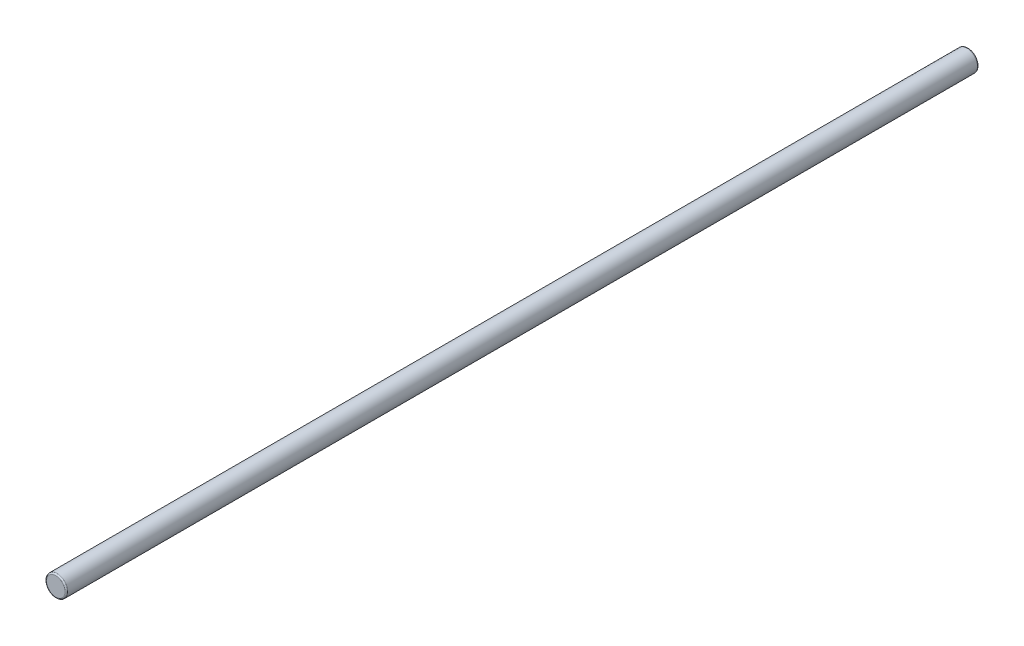
ISO-10303-21;
HEADER;
FILE_DESCRIPTION(('STEP AP214'),'2;1');
FILE_NAME('part.step','',(''),(''),'','','');
FILE_SCHEMA(('AUTOMOTIVE_DESIGN { 1 0 10303 214 1 1 1 1 }'));
ENDSEC;
DATA;
#1=APPLICATION_CONTEXT('core data for automotive mechanical design processes');
#2=APPLICATION_PROTOCOL_DEFINITION('international standard','automotive_design',2000,#1);
#3=PRODUCT_CONTEXT('',#1,'mechanical');
#4=PRODUCT('Part','Part','',(#3));
#5=PRODUCT_RELATED_PRODUCT_CATEGORY('part','',(#4));
#6=PRODUCT_DEFINITION_FORMATION('','',#4);
#7=PRODUCT_DEFINITION_CONTEXT('part definition',#1,'design');
#8=PRODUCT_DEFINITION('design','',#6,#7);
#9=PRODUCT_DEFINITION_SHAPE('','',#8);
#10=(LENGTH_UNIT() NAMED_UNIT(*) SI_UNIT(.MILLI.,.METRE.));
#11=(NAMED_UNIT(*) PLANE_ANGLE_UNIT() SI_UNIT($,.RADIAN.));
#12=(NAMED_UNIT(*) SI_UNIT($,.STERADIAN.) SOLID_ANGLE_UNIT());
#13=UNCERTAINTY_MEASURE_WITH_UNIT(LENGTH_MEASURE(1.E-05),#10,'distance_accuracy_value','');
#14=(GEOMETRIC_REPRESENTATION_CONTEXT(3) GLOBAL_UNCERTAINTY_ASSIGNED_CONTEXT((#13)) GLOBAL_UNIT_ASSIGNED_CONTEXT((#10,
#11,#12)) REPRESENTATION_CONTEXT('',''));
#15=CARTESIAN_POINT('',(0.,0.,0.));
#16=DIRECTION('',(0.,0.,1.));
#17=DIRECTION('',(1.,0.,0.));
#18=AXIS2_PLACEMENT_3D('',#15,#16,#17);
#19=CARTESIAN_POINT('',(0.,0.,345.));
#20=DIRECTION('',(0.,0.,-1.));
#21=DIRECTION('',(-1.,0.,0.));
#22=AXIS2_PLACEMENT_3D('',#19,#20,#21);
#23=CYLINDRICAL_SURFACE('',#22,4.);
#24=CARTESIAN_POINT('',(0.,0.,0.5));
#25=DIRECTION('',(0.,0.,1.));
#26=DIRECTION('',(1.,0.,0.));
#27=AXIS2_PLACEMENT_3D('',#24,#25,#26);
#28=CIRCLE('',#27,4.);
#29=CARTESIAN_POINT('',(4.,0.,0.5));
#30=VERTEX_POINT('',#29);
#31=EDGE_CURVE('E50',#30,#30,#28,.T.);
#32=ORIENTED_EDGE('',*,*,#31,.T.);
#33=EDGE_LOOP('',(#32));
#34=FACE_BOUND('',#33,.T.);
#35=CARTESIAN_POINT('',(0.,0.,344.5));
#36=DIRECTION('',(0.,0.,1.));
#37=DIRECTION('',(1.,0.,0.));
#38=AXIS2_PLACEMENT_3D('',#35,#36,#37);
#39=CIRCLE('',#38,4.);
#40=CARTESIAN_POINT('',(4.,0.,344.5));
#41=VERTEX_POINT('',#40);
#42=EDGE_CURVE('E55',#41,#41,#39,.F.);
#43=ORIENTED_EDGE('',*,*,#42,.T.);
#44=EDGE_LOOP('',(#43));
#45=FACE_BOUND('',#44,.T.);
#46=ADVANCED_FACE('F37',(#34,#45),#23,.T.);
#47=CARTESIAN_POINT('',(0.,0.,345.));
#48=DIRECTION('',(0.,0.,1.));
#49=DIRECTION('',(1.,0.,0.));
#50=AXIS2_PLACEMENT_3D('',#47,#48,#49);
#51=PLANE('',#50);
#52=CARTESIAN_POINT('',(0.,0.,345.));
#53=DIRECTION('',(0.,0.,1.));
#54=DIRECTION('',(1.,0.,0.));
#55=AXIS2_PLACEMENT_3D('',#52,#53,#54);
#56=CIRCLE('',#55,3.5);
#57=CARTESIAN_POINT('',(3.5,0.,345.));
#58=VERTEX_POINT('',#57);
#59=EDGE_CURVE('E10',#58,#58,#56,.T.);
#60=ORIENTED_EDGE('',*,*,#59,.T.);
#61=EDGE_LOOP('',(#60));
#62=FACE_BOUND('',#61,.T.);
#63=ADVANCED_FACE('F72',(#62),#51,.T.);
#64=CARTESIAN_POINT('',(0.,0.,0.));
#65=DIRECTION('',(0.,0.,1.));
#66=DIRECTION('',(1.,0.,0.));
#67=AXIS2_PLACEMENT_3D('',#64,#65,#66);
#68=PLANE('',#67);
#69=CARTESIAN_POINT('',(0.,0.,0.));
#70=DIRECTION('',(0.,0.,1.));
#71=DIRECTION('',(1.,0.,0.));
#72=AXIS2_PLACEMENT_3D('',#69,#70,#71);
#73=CIRCLE('',#72,3.5);
#74=CARTESIAN_POINT('',(3.5,0.,0.));
#75=VERTEX_POINT('',#74);
#76=EDGE_CURVE('E45',#75,#75,#73,.F.);
#77=ORIENTED_EDGE('',*,*,#76,.T.);
#78=EDGE_LOOP('',(#77));
#79=FACE_BOUND('',#78,.T.);
#80=ADVANCED_FACE('F69',(#79),#68,.F.);
#81=CARTESIAN_POINT('',(0.,0.,0.5));
#82=DIRECTION('',(0.,0.,1.));
#83=DIRECTION('',(1.,0.,0.));
#84=AXIS2_PLACEMENT_3D('',#81,#82,#83);
#85=TOROIDAL_SURFACE('',#84,3.5,0.5);
#86=ORIENTED_EDGE('',*,*,#76,.F.);
#87=EDGE_LOOP('',(#86));
#88=FACE_BOUND('',#87,.T.);
#89=ORIENTED_EDGE('',*,*,#31,.F.);
#90=EDGE_LOOP('',(#89));
#91=FACE_BOUND('',#90,.T.);
#92=ADVANCED_FACE('F65',(#88,#91),#85,.T.);
#93=CARTESIAN_POINT('',(0.,0.,344.5));
#94=DIRECTION('',(0.,0.,1.));
#95=DIRECTION('',(1.,0.,0.));
#96=AXIS2_PLACEMENT_3D('',#93,#94,#95);
#97=TOROIDAL_SURFACE('',#96,3.5,0.5);
#98=ORIENTED_EDGE('',*,*,#42,.F.);
#99=EDGE_LOOP('',(#98));
#100=FACE_BOUND('',#99,.T.);
#101=ORIENTED_EDGE('',*,*,#59,.F.);
#102=EDGE_LOOP('',(#101));
#103=FACE_BOUND('',#102,.T.);
#104=ADVANCED_FACE('F39',(#100,#103),#97,.T.);
#105=CLOSED_SHELL('',(#46,#63,#80,#92,#104));
#106=MANIFOLD_SOLID_BREP('B2',#105);
#107=ADVANCED_BREP_SHAPE_REPRESENTATION('',(#18,#106),#14);
#108=SHAPE_DEFINITION_REPRESENTATION(#9,#107);
ENDSEC;
END-ISO-10303-21;
